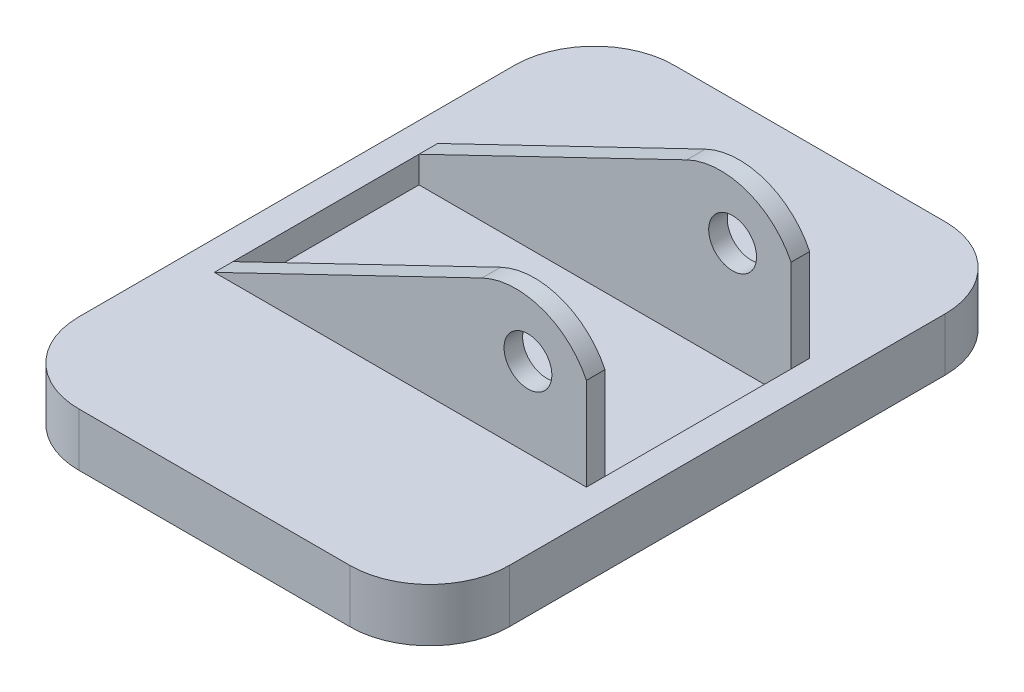
ISO-10303-21;
HEADER;
FILE_DESCRIPTION(('STEP AP214'),'2;1');
FILE_NAME('part.step','',(''),(''),'','','');
FILE_SCHEMA(('AUTOMOTIVE_DESIGN { 1 0 10303 214 1 1 1 1 }'));
ENDSEC;
DATA;
#1=APPLICATION_CONTEXT('core data for automotive mechanical design processes');
#2=APPLICATION_PROTOCOL_DEFINITION('international standard','automotive_design',2000,#1);
#3=PRODUCT_CONTEXT('',#1,'mechanical');
#4=PRODUCT('Part','Part','',(#3));
#5=PRODUCT_RELATED_PRODUCT_CATEGORY('part','',(#4));
#6=PRODUCT_DEFINITION_FORMATION('','',#4);
#7=PRODUCT_DEFINITION_CONTEXT('part definition',#1,'design');
#8=PRODUCT_DEFINITION('design','',#6,#7);
#9=PRODUCT_DEFINITION_SHAPE('','',#8);
#10=(LENGTH_UNIT() NAMED_UNIT(*) SI_UNIT(.MILLI.,.METRE.));
#11=(NAMED_UNIT(*) PLANE_ANGLE_UNIT() SI_UNIT($,.RADIAN.));
#12=(NAMED_UNIT(*) SI_UNIT($,.STERADIAN.) SOLID_ANGLE_UNIT());
#13=UNCERTAINTY_MEASURE_WITH_UNIT(LENGTH_MEASURE(1.E-05),#10,'distance_accuracy_value','');
#14=(GEOMETRIC_REPRESENTATION_CONTEXT(3) GLOBAL_UNCERTAINTY_ASSIGNED_CONTEXT((#13)) GLOBAL_UNIT_ASSIGNED_CONTEXT((#10,
#11,#12)) REPRESENTATION_CONTEXT('',''));
#15=CARTESIAN_POINT('',(0.,0.,0.));
#16=DIRECTION('',(0.,0.,1.));
#17=DIRECTION('',(1.,0.,0.));
#18=AXIS2_PLACEMENT_3D('',#15,#16,#17);
#19=CARTESIAN_POINT('',(75.5,37.,-35.));
#20=DIRECTION('',(-1.,0.,0.));
#21=DIRECTION('',(0.,0.,1.));
#22=AXIS2_PLACEMENT_3D('',#19,#20,#21);
#23=PLANE('',#22);
#24=DIRECTION('',(0.,1.,0.));
#25=VECTOR('',#24,1.);
#26=CARTESIAN_POINT('',(75.5,5.,-38.5));
#27=LINE('',#26,#25);
#28=CARTESIAN_POINT('',(75.5,10.,-38.5));
#29=VERTEX_POINT('',#28);
#30=CARTESIAN_POINT('',(75.5,27.396377444738,-38.5));
#31=VERTEX_POINT('',#30);
#32=EDGE_CURVE('E240',#29,#31,#27,.T.);
#33=ORIENTED_EDGE('',*,*,#32,.T.);
#34=DIRECTION('',(0.,0.,1.));
#35=VECTOR('',#34,1.);
#36=CARTESIAN_POINT('',(75.5,27.396377444738,-112.));
#37=LINE('',#36,#35);
#38=CARTESIAN_POINT('',(75.5,27.396377444738,-35.));
#39=VERTEX_POINT('',#38);
#40=EDGE_CURVE('E55',#31,#39,#37,.T.);
#41=ORIENTED_EDGE('',*,*,#40,.T.);
#42=DIRECTION('',(0.,-1.,0.));
#43=VECTOR('',#42,1.);
#44=CARTESIAN_POINT('',(75.5,37.,-35.));
#45=LINE('',#44,#43);
#46=CARTESIAN_POINT('',(75.5,10.,-35.));
#47=VERTEX_POINT('',#46);
#48=EDGE_CURVE('E185',#39,#47,#45,.T.);
#49=ORIENTED_EDGE('',*,*,#48,.T.);
#50=DIRECTION('',(0.,0.,-1.));
#51=VECTOR('',#50,1.);
#52=CARTESIAN_POINT('',(75.5,10.,-35.));
#53=LINE('',#52,#51);
#54=EDGE_CURVE('E260',#47,#29,#53,.T.);
#55=ORIENTED_EDGE('',*,*,#54,.T.);
#56=EDGE_LOOP('',(#33,#41,#49,#55));
#57=FACE_BOUND('',#56,.T.);
#58=ADVANCED_FACE('F39',(#57),#23,.F.);
#59=CARTESIAN_POINT('',(66.,10.,-15.));
#60=DIRECTION('',(0.,1.,0.));
#61=DIRECTION('',(0.,0.,1.));
#62=AXIS2_PLACEMENT_3D('',#59,#60,#61);
#63=PLANE('',#62);
#64=CARTESIAN_POINT('',(15.,10.,-97.));
#65=DIRECTION('',(0.,1.,0.));
#66=DIRECTION('',(0.,0.,-1.));
#67=AXIS2_PLACEMENT_3D('',#64,#65,#66);
#68=CIRCLE('',#67,15.);
#69=CARTESIAN_POINT('',(15.,10.,-112.));
#70=VERTEX_POINT('',#69);
#71=CARTESIAN_POINT('',(0.,10.,-96.9999999999999));
#72=VERTEX_POINT('',#71);
#73=EDGE_CURVE('E294',#70,#72,#68,.T.);
#74=ORIENTED_EDGE('',*,*,#73,.T.);
#75=DIRECTION('',(0.,0.,1.));
#76=VECTOR('',#75,1.);
#77=CARTESIAN_POINT('',(0.,10.,-15.0000000000001));
#78=LINE('',#77,#76);
#79=CARTESIAN_POINT('',(0.,10.,-15.0000000000001));
#80=VERTEX_POINT('',#79);
#81=EDGE_CURVE('E297',#72,#80,#78,.T.);
#82=ORIENTED_EDGE('',*,*,#81,.T.);
#83=CARTESIAN_POINT('',(15.,10.,-15.));
#84=DIRECTION('',(0.,1.,0.));
#85=DIRECTION('',(0.,0.,-1.));
#86=AXIS2_PLACEMENT_3D('',#83,#84,#85);
#87=CIRCLE('',#86,15.);
#88=CARTESIAN_POINT('',(15.0000000000001,10.,0.));
#89=VERTEX_POINT('',#88);
#90=EDGE_CURVE('E300',#80,#89,#87,.T.);
#91=ORIENTED_EDGE('',*,*,#90,.T.);
#92=DIRECTION('',(1.,0.,0.));
#93=VECTOR('',#92,1.);
#94=CARTESIAN_POINT('',(15.0000000000001,10.,0.));
#95=LINE('',#94,#93);
#96=CARTESIAN_POINT('',(65.9999999999999,10.,0.));
#97=VERTEX_POINT('',#96);
#98=EDGE_CURVE('E303',#89,#97,#95,.T.);
#99=ORIENTED_EDGE('',*,*,#98,.T.);
#100=CARTESIAN_POINT('',(66.,10.,-15.));
#101=DIRECTION('',(0.,1.,0.));
#102=DIRECTION('',(0.,0.,1.));
#103=AXIS2_PLACEMENT_3D('',#100,#101,#102);
#104=CIRCLE('',#103,15.);
#105=CARTESIAN_POINT('',(81.,10.,-15.0000000000001));
#106=VERTEX_POINT('',#105);
#107=EDGE_CURVE('E280',#97,#106,#104,.T.);
#108=ORIENTED_EDGE('',*,*,#107,.T.);
#109=DIRECTION('',(0.,0.,-1.));
#110=VECTOR('',#109,1.);
#111=CARTESIAN_POINT('',(81.,10.,-15.0000000000001));
#112=LINE('',#111,#110);
#113=CARTESIAN_POINT('',(81.,10.,-96.9999999999999));
#114=VERTEX_POINT('',#113);
#115=EDGE_CURVE('E284',#106,#114,#112,.T.);
#116=ORIENTED_EDGE('',*,*,#115,.T.);
#117=CARTESIAN_POINT('',(66.,10.,-97.));
#118=DIRECTION('',(0.,1.,0.));
#119=DIRECTION('',(0.,0.,1.));
#120=AXIS2_PLACEMENT_3D('',#117,#118,#119);
#121=CIRCLE('',#120,15.);
#122=CARTESIAN_POINT('',(65.9999999999999,10.,-112.));
#123=VERTEX_POINT('',#122);
#124=EDGE_CURVE('E288',#114,#123,#121,.T.);
#125=ORIENTED_EDGE('',*,*,#124,.T.);
#126=DIRECTION('',(-1.,0.,0.));
#127=VECTOR('',#126,1.);
#128=CARTESIAN_POINT('',(15.0000000000001,10.,-112.));
#129=LINE('',#128,#127);
#130=EDGE_CURVE('E291',#123,#70,#129,.T.);
#131=ORIENTED_EDGE('',*,*,#130,.T.);
#132=EDGE_LOOP('',(#74,#82,#91,#99,#108,#116,#125,#131));
#133=FACE_BOUND('',#132,.T.);
#134=DIRECTION('',(0.,0.,1.));
#135=VECTOR('',#134,1.);
#136=CARTESIAN_POINT('',(5.50000000000001,10.,-35.));
#137=LINE('',#136,#135);
#138=CARTESIAN_POINT('',(5.50000000000001,10.,-77.));
#139=VERTEX_POINT('',#138);
#140=CARTESIAN_POINT('',(5.50000000000001,10.,-73.5));
#141=VERTEX_POINT('',#140);
#142=EDGE_CURVE('E268',#139,#141,#137,.T.);
#143=ORIENTED_EDGE('',*,*,#142,.F.);
#144=DIRECTION('',(-1.,0.,0.));
#145=VECTOR('',#144,1.);
#146=CARTESIAN_POINT('',(5.50000000000001,10.,-77.));
#147=LINE('',#146,#145);
#148=CARTESIAN_POINT('',(75.5,10.,-77.));
#149=VERTEX_POINT('',#148);
#150=EDGE_CURVE('E264',#149,#139,#147,.T.);
#151=ORIENTED_EDGE('',*,*,#150,.F.);
#152=CARTESIAN_POINT('',(75.5,10.,-73.5));
#153=VERTEX_POINT('',#152);
#154=EDGE_CURVE('E259',#153,#149,#53,.T.);
#155=ORIENTED_EDGE('',*,*,#154,.F.);
#156=DIRECTION('',(0.,0.,-1.));
#157=VECTOR('',#156,1.);
#158=CARTESIAN_POINT('',(75.5,10.,-15.));
#159=LINE('',#158,#157);
#160=EDGE_CURVE('E256',#29,#153,#159,.T.);
#161=ORIENTED_EDGE('',*,*,#160,.F.);
#162=ORIENTED_EDGE('',*,*,#54,.F.);
#163=DIRECTION('',(1.,0.,0.));
#164=VECTOR('',#163,1.);
#165=CARTESIAN_POINT('',(5.50000000000001,10.,-35.));
#166=LINE('',#165,#164);
#167=CARTESIAN_POINT('',(5.50000000000001,10.,-35.));
#168=VERTEX_POINT('',#167);
#169=EDGE_CURVE('E271',#168,#47,#166,.T.);
#170=ORIENTED_EDGE('',*,*,#169,.F.);
#171=CARTESIAN_POINT('',(5.50000000000001,10.,-38.5));
#172=VERTEX_POINT('',#171);
#173=EDGE_CURVE('E177',#172,#168,#137,.T.);
#174=ORIENTED_EDGE('',*,*,#173,.F.);
#175=DIRECTION('',(0.,0.,1.));
#176=VECTOR('',#175,1.);
#177=CARTESIAN_POINT('',(5.50000000000001,10.,-15.));
#178=LINE('',#177,#176);
#179=EDGE_CURVE('E239',#141,#172,#178,.T.);
#180=ORIENTED_EDGE('',*,*,#179,.F.);
#181=EDGE_LOOP('',(#143,#151,#155,#161,#162,#170,#174,#180));
#182=FACE_BOUND('',#181,.T.);
#183=ADVANCED_FACE('F387',(#133,#182),#63,.T.);
#184=CARTESIAN_POINT('',(66.,10.,-15.));
#185=DIRECTION('',(0.,-1.,0.));
#186=DIRECTION('',(0.,0.,-1.));
#187=AXIS2_PLACEMENT_3D('',#184,#185,#186);
#188=CYLINDRICAL_SURFACE('',#187,15.);
#189=CARTESIAN_POINT('',(66.,0.,-15.));
#190=DIRECTION('',(0.,1.,0.));
#191=DIRECTION('',(0.,0.,1.));
#192=AXIS2_PLACEMENT_3D('',#189,#190,#191);
#193=CIRCLE('',#192,15.);
#194=CARTESIAN_POINT('',(65.9999999999999,0.,0.));
#195=VERTEX_POINT('',#194);
#196=CARTESIAN_POINT('',(81.,0.,-15.0000000000001));
#197=VERTEX_POINT('',#196);
#198=EDGE_CURVE('E279',#195,#197,#193,.T.);
#199=ORIENTED_EDGE('',*,*,#198,.T.);
#200=DIRECTION('',(0.,-1.,0.));
#201=VECTOR('',#200,1.);
#202=CARTESIAN_POINT('',(81.,10.,-15.0000000000001));
#203=LINE('',#202,#201);
#204=EDGE_CURVE('E357',#106,#197,#203,.T.);
#205=ORIENTED_EDGE('',*,*,#204,.F.);
#206=ORIENTED_EDGE('',*,*,#107,.F.);
#207=DIRECTION('',(0.,-1.,0.));
#208=VECTOR('',#207,1.);
#209=CARTESIAN_POINT('',(65.9999999999999,10.,0.));
#210=LINE('',#209,#208);
#211=EDGE_CURVE('E306',#97,#195,#210,.T.);
#212=ORIENTED_EDGE('',*,*,#211,.T.);
#213=EDGE_LOOP('',(#199,#205,#206,#212));
#214=FACE_BOUND('',#213,.T.);
#215=ADVANCED_FACE('F41',(#214),#188,.T.);
#216=CARTESIAN_POINT('',(81.,10.,-15.0000000000001));
#217=DIRECTION('',(-1.,0.,0.));
#218=DIRECTION('',(0.,0.,1.));
#219=AXIS2_PLACEMENT_3D('',#216,#217,#218);
#220=PLANE('',#219);
#221=DIRECTION('',(0.,0.,-1.));
#222=VECTOR('',#221,1.);
#223=CARTESIAN_POINT('',(81.,0.,-15.0000000000001));
#224=LINE('',#223,#222);
#225=CARTESIAN_POINT('',(81.,0.,-96.9999999999999));
#226=VERTEX_POINT('',#225);
#227=EDGE_CURVE('E310',#197,#226,#224,.T.);
#228=ORIENTED_EDGE('',*,*,#227,.T.);
#229=DIRECTION('',(0.,-1.,0.));
#230=VECTOR('',#229,1.);
#231=CARTESIAN_POINT('',(81.,10.,-96.9999999999999));
#232=LINE('',#231,#230);
#233=EDGE_CURVE('E353',#114,#226,#232,.T.);
#234=ORIENTED_EDGE('',*,*,#233,.F.);
#235=ORIENTED_EDGE('',*,*,#115,.F.);
#236=ORIENTED_EDGE('',*,*,#204,.T.);
#237=EDGE_LOOP('',(#228,#234,#235,#236));
#238=FACE_BOUND('',#237,.T.);
#239=ADVANCED_FACE('F449',(#238),#220,.F.);
#240=CARTESIAN_POINT('',(66.,10.,-97.));
#241=DIRECTION('',(0.,-1.,0.));
#242=DIRECTION('',(0.,0.,-1.));
#243=AXIS2_PLACEMENT_3D('',#240,#241,#242);
#244=CYLINDRICAL_SURFACE('',#243,15.);
#245=CARTESIAN_POINT('',(66.,0.,-97.));
#246=DIRECTION('',(0.,1.,0.));
#247=DIRECTION('',(0.,0.,1.));
#248=AXIS2_PLACEMENT_3D('',#245,#246,#247);
#249=CIRCLE('',#248,15.);
#250=CARTESIAN_POINT('',(65.9999999999999,0.,-112.));
#251=VERTEX_POINT('',#250);
#252=EDGE_CURVE('E313',#226,#251,#249,.T.);
#253=ORIENTED_EDGE('',*,*,#252,.T.);
#254=DIRECTION('',(0.,-1.,0.));
#255=VECTOR('',#254,1.);
#256=CARTESIAN_POINT('',(65.9999999999999,10.,-112.));
#257=LINE('',#256,#255);
#258=EDGE_CURVE('E349',#123,#251,#257,.T.);
#259=ORIENTED_EDGE('',*,*,#258,.F.);
#260=ORIENTED_EDGE('',*,*,#124,.F.);
#261=ORIENTED_EDGE('',*,*,#233,.T.);
#262=EDGE_LOOP('',(#253,#259,#260,#261));
#263=FACE_BOUND('',#262,.T.);
#264=ADVANCED_FACE('F446',(#263),#244,.T.);
#265=CARTESIAN_POINT('',(15.0000000000001,10.,-112.));
#266=DIRECTION('',(0.,0.,1.));
#267=DIRECTION('',(1.,0.,0.));
#268=AXIS2_PLACEMENT_3D('',#265,#266,#267);
#269=PLANE('',#268);
#270=DIRECTION('',(-1.,0.,0.));
#271=VECTOR('',#270,1.);
#272=CARTESIAN_POINT('',(15.0000000000001,0.,-112.));
#273=LINE('',#272,#271);
#274=CARTESIAN_POINT('',(15.,0.,-112.));
#275=VERTEX_POINT('',#274);
#276=EDGE_CURVE('E316',#251,#275,#273,.T.);
#277=ORIENTED_EDGE('',*,*,#276,.T.);
#278=DIRECTION('',(0.,-1.,0.));
#279=VECTOR('',#278,1.);
#280=CARTESIAN_POINT('',(15.,10.,-112.));
#281=LINE('',#280,#279);
#282=EDGE_CURVE('E345',#70,#275,#281,.T.);
#283=ORIENTED_EDGE('',*,*,#282,.F.);
#284=ORIENTED_EDGE('',*,*,#130,.F.);
#285=ORIENTED_EDGE('',*,*,#258,.T.);
#286=EDGE_LOOP('',(#277,#283,#284,#285));
#287=FACE_BOUND('',#286,.T.);
#288=ADVANCED_FACE('F442',(#287),#269,.F.);
#289=CARTESIAN_POINT('',(15.,10.,-97.));
#290=DIRECTION('',(0.,-1.,0.));
#291=DIRECTION('',(0.,0.,-1.));
#292=AXIS2_PLACEMENT_3D('',#289,#290,#291);
#293=CYLINDRICAL_SURFACE('',#292,15.);
#294=CARTESIAN_POINT('',(15.,0.,-97.));
#295=DIRECTION('',(0.,1.,0.));
#296=DIRECTION('',(0.,0.,-1.));
#297=AXIS2_PLACEMENT_3D('',#294,#295,#296);
#298=CIRCLE('',#297,15.);
#299=CARTESIAN_POINT('',(0.,0.,-96.9999999999999));
#300=VERTEX_POINT('',#299);
#301=EDGE_CURVE('E319',#275,#300,#298,.T.);
#302=ORIENTED_EDGE('',*,*,#301,.T.);
#303=DIRECTION('',(0.,-1.,0.));
#304=VECTOR('',#303,1.);
#305=CARTESIAN_POINT('',(0.,10.,-96.9999999999999));
#306=LINE('',#305,#304);
#307=EDGE_CURVE('E341',#72,#300,#306,.T.);
#308=ORIENTED_EDGE('',*,*,#307,.F.);
#309=ORIENTED_EDGE('',*,*,#73,.F.);
#310=ORIENTED_EDGE('',*,*,#282,.T.);
#311=EDGE_LOOP('',(#302,#308,#309,#310));
#312=FACE_BOUND('',#311,.T.);
#313=ADVANCED_FACE('F438',(#312),#293,.T.);
#314=CARTESIAN_POINT('',(0.,10.,-15.0000000000001));
#315=DIRECTION('',(1.,0.,0.));
#316=DIRECTION('',(0.,0.,-1.));
#317=AXIS2_PLACEMENT_3D('',#314,#315,#316);
#318=PLANE('',#317);
#319=DIRECTION('',(0.,0.,1.));
#320=VECTOR('',#319,1.);
#321=CARTESIAN_POINT('',(0.,0.,-15.0000000000001));
#322=LINE('',#321,#320);
#323=CARTESIAN_POINT('',(0.,0.,-15.0000000000001));
#324=VERTEX_POINT('',#323);
#325=EDGE_CURVE('E322',#300,#324,#322,.T.);
#326=ORIENTED_EDGE('',*,*,#325,.T.);
#327=DIRECTION('',(0.,-1.,0.));
#328=VECTOR('',#327,1.);
#329=CARTESIAN_POINT('',(0.,10.,-15.0000000000001));
#330=LINE('',#329,#328);
#331=EDGE_CURVE('E337',#80,#324,#330,.T.);
#332=ORIENTED_EDGE('',*,*,#331,.F.);
#333=ORIENTED_EDGE('',*,*,#81,.F.);
#334=ORIENTED_EDGE('',*,*,#307,.T.);
#335=EDGE_LOOP('',(#326,#332,#333,#334));
#336=FACE_BOUND('',#335,.T.);
#337=ADVANCED_FACE('F434',(#336),#318,.F.);
#338=CARTESIAN_POINT('',(15.,10.,-15.));
#339=DIRECTION('',(0.,-1.,0.));
#340=DIRECTION('',(0.,0.,-1.));
#341=AXIS2_PLACEMENT_3D('',#338,#339,#340);
#342=CYLINDRICAL_SURFACE('',#341,15.);
#343=CARTESIAN_POINT('',(15.,0.,-15.));
#344=DIRECTION('',(0.,1.,0.));
#345=DIRECTION('',(0.,0.,-1.));
#346=AXIS2_PLACEMENT_3D('',#343,#344,#345);
#347=CIRCLE('',#346,15.);
#348=CARTESIAN_POINT('',(15.0000000000001,0.,0.));
#349=VERTEX_POINT('',#348);
#350=EDGE_CURVE('E325',#324,#349,#347,.T.);
#351=ORIENTED_EDGE('',*,*,#350,.T.);
#352=DIRECTION('',(0.,-1.,0.));
#353=VECTOR('',#352,1.);
#354=CARTESIAN_POINT('',(15.0000000000001,10.,0.));
#355=LINE('',#354,#353);
#356=EDGE_CURVE('E333',#89,#349,#355,.T.);
#357=ORIENTED_EDGE('',*,*,#356,.F.);
#358=ORIENTED_EDGE('',*,*,#90,.F.);
#359=ORIENTED_EDGE('',*,*,#331,.T.);
#360=EDGE_LOOP('',(#351,#357,#358,#359));
#361=FACE_BOUND('',#360,.T.);
#362=ADVANCED_FACE('F427',(#361),#342,.T.);
#363=CARTESIAN_POINT('',(15.0000000000001,10.,0.));
#364=DIRECTION('',(0.,0.,-1.));
#365=DIRECTION('',(-1.,0.,0.));
#366=AXIS2_PLACEMENT_3D('',#363,#364,#365);
#367=PLANE('',#366);
#368=DIRECTION('',(1.,0.,0.));
#369=VECTOR('',#368,1.);
#370=CARTESIAN_POINT('',(15.0000000000001,0.,0.));
#371=LINE('',#370,#369);
#372=EDGE_CURVE('E285',#349,#195,#371,.T.);
#373=ORIENTED_EDGE('',*,*,#372,.T.);
#374=ORIENTED_EDGE('',*,*,#211,.F.);
#375=ORIENTED_EDGE('',*,*,#98,.F.);
#376=ORIENTED_EDGE('',*,*,#356,.T.);
#377=EDGE_LOOP('',(#373,#374,#375,#376));
#378=FACE_BOUND('',#377,.T.);
#379=ADVANCED_FACE('F421',(#378),#367,.F.);
#380=CARTESIAN_POINT('',(66.,0.,-15.));
#381=DIRECTION('',(0.,1.,0.));
#382=DIRECTION('',(0.,0.,1.));
#383=AXIS2_PLACEMENT_3D('',#380,#381,#382);
#384=PLANE('',#383);
#385=ORIENTED_EDGE('',*,*,#198,.F.);
#386=ORIENTED_EDGE('',*,*,#372,.F.);
#387=ORIENTED_EDGE('',*,*,#350,.F.);
#388=ORIENTED_EDGE('',*,*,#325,.F.);
#389=ORIENTED_EDGE('',*,*,#301,.F.);
#390=ORIENTED_EDGE('',*,*,#276,.F.);
#391=ORIENTED_EDGE('',*,*,#252,.F.);
#392=ORIENTED_EDGE('',*,*,#227,.F.);
#393=EDGE_LOOP('',(#385,#386,#387,#388,#389,#390,#391,#392));
#394=FACE_BOUND('',#393,.T.);
#395=ADVANCED_FACE('F415',(#394),#384,.F.);
#396=DIRECTION('',(0.,-1.,0.));
#397=VECTOR('',#396,1.);
#398=CARTESIAN_POINT('',(75.5,37.,-77.));
#399=LINE('',#398,#397);
#400=CARTESIAN_POINT('',(75.5,27.396377444738,-77.));
#401=VERTEX_POINT('',#400);
#402=EDGE_CURVE('E276',#401,#149,#399,.T.);
#403=ORIENTED_EDGE('',*,*,#402,.F.);
#404=CARTESIAN_POINT('',(75.5,27.396377444738,-73.5));
#405=VERTEX_POINT('',#404);
#406=EDGE_CURVE('E190',#401,#405,#37,.T.);
#407=ORIENTED_EDGE('',*,*,#406,.T.);
#408=DIRECTION('',(0.,1.,0.));
#409=VECTOR('',#408,1.);
#410=CARTESIAN_POINT('',(75.5,5.,-73.5));
#411=LINE('',#410,#409);
#412=EDGE_CURVE('E234',#153,#405,#411,.T.);
#413=ORIENTED_EDGE('',*,*,#412,.F.);
#414=ORIENTED_EDGE('',*,*,#154,.T.);
#415=EDGE_LOOP('',(#403,#407,#413,#414));
#416=FACE_BOUND('',#415,.T.);
#417=ADVANCED_FACE('F373',(#416),#23,.F.);
#418=CARTESIAN_POINT('',(5.50000000000001,37.,-77.));
#419=DIRECTION('',(0.,0.,1.));
#420=DIRECTION('',(1.,0.,0.));
#421=AXIS2_PLACEMENT_3D('',#418,#419,#420);
#422=PLANE('',#421);
#423=CARTESIAN_POINT('',(64.5,25.,-77.));
#424=DIRECTION('',(0.,0.,1.));
#425=DIRECTION('',(1.,0.,0.));
#426=AXIS2_PLACEMENT_3D('',#423,#424,#425);
#427=CIRCLE('',#426,4.5);
#428=CARTESIAN_POINT('',(69.,25.,-77.));
#429=VERTEX_POINT('',#428);
#430=EDGE_CURVE('E201',#429,#429,#427,.T.);
#431=ORIENTED_EDGE('',*,*,#430,.T.);
#432=EDGE_LOOP('',(#431));
#433=FACE_BOUND('',#432,.T.);
#434=ORIENTED_EDGE('',*,*,#150,.T.);
#435=DIRECTION('',(0.900911766554061,0.434002291335473,0.));
#436=VECTOR('',#435,1.);
#437=CARTESIAN_POINT('',(16.0569398163399,15.0856656998799,-77.));
#438=LINE('',#437,#436);
#439=CARTESIAN_POINT('',(55.866672389115,34.2634762196852,-77.));
#440=VERTEX_POINT('',#439);
#441=EDGE_CURVE('E214',#139,#440,#438,.T.);
#442=ORIENTED_EDGE('',*,*,#441,.T.);
#443=CARTESIAN_POINT('',(62.249786807084,21.0132630267691,-77.));
#444=DIRECTION('',(0.,0.,1.));
#445=DIRECTION('',(1.,0.,0.));
#446=AXIS2_PLACEMENT_3D('',#443,#444,#445);
#447=CIRCLE('',#446,14.7075592581029);
#448=EDGE_CURVE('E207',#440,#401,#447,.F.);
#449=ORIENTED_EDGE('',*,*,#448,.T.);
#450=ORIENTED_EDGE('',*,*,#402,.T.);
#451=EDGE_LOOP('',(#434,#442,#449,#450));
#452=FACE_BOUND('',#451,.T.);
#453=ADVANCED_FACE('F390',(#433,#452),#422,.F.);
#454=CARTESIAN_POINT('',(5.50000000000001,37.,-35.));
#455=DIRECTION('',(0.,0.,-1.));
#456=DIRECTION('',(-1.,0.,0.));
#457=AXIS2_PLACEMENT_3D('',#454,#455,#456);
#458=PLANE('',#457);
#459=CARTESIAN_POINT('',(64.5,25.,-35.));
#460=DIRECTION('',(0.,0.,1.));
#461=DIRECTION('',(1.,0.,0.));
#462=AXIS2_PLACEMENT_3D('',#459,#460,#461);
#463=CIRCLE('',#462,4.5);
#464=CARTESIAN_POINT('',(69.,25.,-35.));
#465=VERTEX_POINT('',#464);
#466=EDGE_CURVE('E192',#465,#465,#463,.T.);
#467=ORIENTED_EDGE('',*,*,#466,.F.);
#468=EDGE_LOOP('',(#467));
#469=FACE_BOUND('',#468,.T.);
#470=CARTESIAN_POINT('',(62.249786807084,21.0132630267691,-35.));
#471=DIRECTION('',(0.,0.,-1.));
#472=DIRECTION('',(-1.,0.,0.));
#473=AXIS2_PLACEMENT_3D('',#470,#471,#472);
#474=CIRCLE('',#473,14.7075592581029);
#475=CARTESIAN_POINT('',(55.866672389115,34.2634762196852,-35.));
#476=VERTEX_POINT('',#475);
#477=EDGE_CURVE('E167',#476,#39,#474,.T.);
#478=ORIENTED_EDGE('',*,*,#477,.F.);
#479=DIRECTION('',(0.900911766554061,0.434002291335473,0.));
#480=VECTOR('',#479,1.);
#481=CARTESIAN_POINT('',(5.50000000000001,10.,-35.));
#482=LINE('',#481,#480);
#483=EDGE_CURVE('E174',#168,#476,#482,.T.);
#484=ORIENTED_EDGE('',*,*,#483,.F.);
#485=ORIENTED_EDGE('',*,*,#169,.T.);
#486=ORIENTED_EDGE('',*,*,#48,.F.);
#487=EDGE_LOOP('',(#478,#484,#485,#486));
#488=FACE_BOUND('',#487,.T.);
#489=ADVANCED_FACE('F184',(#469,#488),#458,.F.);
#490=CARTESIAN_POINT('',(75.5,5.,-38.5));
#491=DIRECTION('',(1.,0.,0.));
#492=DIRECTION('',(0.,0.,-1.));
#493=AXIS2_PLACEMENT_3D('',#490,#491,#492);
#494=PLANE('',#493);
#495=ORIENTED_EDGE('',*,*,#160,.T.);
#496=CARTESIAN_POINT('',(75.5,5.,-73.5));
#497=VERTEX_POINT('',#496);
#498=EDGE_CURVE('E249',#497,#153,#411,.T.);
#499=ORIENTED_EDGE('',*,*,#498,.F.);
#500=DIRECTION('',(0.,0.,-1.));
#501=VECTOR('',#500,1.);
#502=CARTESIAN_POINT('',(75.5,5.,-38.5));
#503=LINE('',#502,#501);
#504=CARTESIAN_POINT('',(75.5,5.,-38.5));
#505=VERTEX_POINT('',#504);
#506=EDGE_CURVE('E218',#505,#497,#503,.T.);
#507=ORIENTED_EDGE('',*,*,#506,.F.);
#508=EDGE_CURVE('E235',#505,#29,#27,.T.);
#509=ORIENTED_EDGE('',*,*,#508,.T.);
#510=EDGE_LOOP('',(#495,#499,#507,#509));
#511=FACE_BOUND('',#510,.T.);
#512=ADVANCED_FACE('F515',(#511),#494,.F.);
#513=CARTESIAN_POINT('',(5.5,5.,-38.5));
#514=DIRECTION('',(0.,0.,1.));
#515=DIRECTION('',(1.,0.,0.));
#516=AXIS2_PLACEMENT_3D('',#513,#514,#515);
#517=PLANE('',#516);
#518=CARTESIAN_POINT('',(64.5,25.,-38.5));
#519=DIRECTION('',(0.,0.,1.));
#520=DIRECTION('',(1.,0.,0.));
#521=AXIS2_PLACEMENT_3D('',#518,#519,#520);
#522=CIRCLE('',#521,4.5);
#523=CARTESIAN_POINT('',(69.,25.,-38.5));
#524=VERTEX_POINT('',#523);
#525=EDGE_CURVE('E197',#524,#524,#522,.T.);
#526=ORIENTED_EDGE('',*,*,#525,.T.);
#527=EDGE_LOOP('',(#526));
#528=FACE_BOUND('',#527,.T.);
#529=DIRECTION('',(0.,1.,0.));
#530=VECTOR('',#529,1.);
#531=CARTESIAN_POINT('',(5.5,5.,-38.5));
#532=LINE('',#531,#530);
#533=CARTESIAN_POINT('',(5.5,5.,-38.5));
#534=VERTEX_POINT('',#533);
#535=EDGE_CURVE('E241',#534,#172,#532,.T.);
#536=ORIENTED_EDGE('',*,*,#535,.T.);
#537=DIRECTION('',(0.900911766554061,0.434002291335473,0.));
#538=VECTOR('',#537,1.);
#539=CARTESIAN_POINT('',(3.54501114512225,9.0582100555778,-38.5));
#540=LINE('',#539,#538);
#541=CARTESIAN_POINT('',(55.866672389115,34.2634762196852,-38.5));
#542=VERTEX_POINT('',#541);
#543=EDGE_CURVE('E211',#172,#542,#540,.T.);
#544=ORIENTED_EDGE('',*,*,#543,.T.);
#545=CARTESIAN_POINT('',(62.249786807084,21.0132630267691,-38.5));
#546=DIRECTION('',(0.,0.,1.));
#547=DIRECTION('',(1.,0.,0.));
#548=AXIS2_PLACEMENT_3D('',#545,#546,#547);
#549=CIRCLE('',#548,14.7075592581029);
#550=EDGE_CURVE('E168',#542,#31,#549,.F.);
#551=ORIENTED_EDGE('',*,*,#550,.T.);
#552=ORIENTED_EDGE('',*,*,#32,.F.);
#553=ORIENTED_EDGE('',*,*,#508,.F.);
#554=DIRECTION('',(1.,0.,0.));
#555=VECTOR('',#554,1.);
#556=CARTESIAN_POINT('',(5.5,5.,-38.5));
#557=LINE('',#556,#555);
#558=EDGE_CURVE('E230',#534,#505,#557,.T.);
#559=ORIENTED_EDGE('',*,*,#558,.F.);
#560=EDGE_LOOP('',(#536,#544,#551,#552,#553,#559));
#561=FACE_BOUND('',#560,.T.);
#562=ADVANCED_FACE('F522',(#528,#561),#517,.F.);
#563=CARTESIAN_POINT('',(5.5,5.,-38.5));
#564=DIRECTION('',(-1.,0.,0.));
#565=DIRECTION('',(0.,0.,1.));
#566=AXIS2_PLACEMENT_3D('',#563,#564,#565);
#567=PLANE('',#566);
#568=ORIENTED_EDGE('',*,*,#179,.T.);
#569=ORIENTED_EDGE('',*,*,#535,.F.);
#570=DIRECTION('',(0.,0.,1.));
#571=VECTOR('',#570,1.);
#572=CARTESIAN_POINT('',(5.5,5.,-38.5));
#573=LINE('',#572,#571);
#574=CARTESIAN_POINT('',(5.5,5.,-73.5));
#575=VERTEX_POINT('',#574);
#576=EDGE_CURVE('E226',#575,#534,#573,.T.);
#577=ORIENTED_EDGE('',*,*,#576,.F.);
#578=DIRECTION('',(0.,1.,0.));
#579=VECTOR('',#578,1.);
#580=CARTESIAN_POINT('',(5.5,5.,-73.5));
#581=LINE('',#580,#579);
#582=EDGE_CURVE('E245',#575,#141,#581,.T.);
#583=ORIENTED_EDGE('',*,*,#582,.T.);
#584=EDGE_LOOP('',(#568,#569,#577,#583));
#585=FACE_BOUND('',#584,.T.);
#586=ADVANCED_FACE('F527',(#585),#567,.F.);
#587=CARTESIAN_POINT('',(5.5,5.,-73.5));
#588=DIRECTION('',(0.,0.,-1.));
#589=DIRECTION('',(-1.,0.,0.));
#590=AXIS2_PLACEMENT_3D('',#587,#588,#589);
#591=PLANE('',#590);
#592=CARTESIAN_POINT('',(64.5,25.,-73.5));
#593=DIRECTION('',(0.,0.,-1.));
#594=DIRECTION('',(-1.,0.,0.));
#595=AXIS2_PLACEMENT_3D('',#592,#593,#594);
#596=CIRCLE('',#595,4.5);
#597=CARTESIAN_POINT('',(60.,25.,-73.5));
#598=VERTEX_POINT('',#597);
#599=EDGE_CURVE('E196',#598,#598,#596,.T.);
#600=ORIENTED_EDGE('',*,*,#599,.T.);
#601=EDGE_LOOP('',(#600));
#602=FACE_BOUND('',#601,.T.);
#603=CARTESIAN_POINT('',(62.249786807084,21.0132630267691,-73.5));
#604=DIRECTION('',(0.,0.,-1.));
#605=DIRECTION('',(-1.,0.,0.));
#606=AXIS2_PLACEMENT_3D('',#603,#604,#605);
#607=CIRCLE('',#606,14.7075592581029);
#608=CARTESIAN_POINT('',(55.866672389115,34.2634762196852,-73.5));
#609=VERTEX_POINT('',#608);
#610=EDGE_CURVE('E48',#405,#609,#607,.F.);
#611=ORIENTED_EDGE('',*,*,#610,.T.);
#612=DIRECTION('',(-0.900911766554061,-0.434002291335473,0.));
#613=VECTOR('',#612,1.);
#614=CARTESIAN_POINT('',(3.54501114512225,9.0582100555778,-73.5));
#615=LINE('',#614,#613);
#616=EDGE_CURVE('E11',#609,#141,#615,.T.);
#617=ORIENTED_EDGE('',*,*,#616,.T.);
#618=ORIENTED_EDGE('',*,*,#582,.F.);
#619=DIRECTION('',(-1.,0.,0.));
#620=VECTOR('',#619,1.);
#621=CARTESIAN_POINT('',(5.5,5.,-73.5));
#622=LINE('',#621,#620);
#623=EDGE_CURVE('E222',#497,#575,#622,.T.);
#624=ORIENTED_EDGE('',*,*,#623,.F.);
#625=ORIENTED_EDGE('',*,*,#498,.T.);
#626=ORIENTED_EDGE('',*,*,#412,.T.);
#627=EDGE_LOOP('',(#611,#617,#618,#624,#625,#626));
#628=FACE_BOUND('',#627,.T.);
#629=ADVANCED_FACE('F367',(#602,#628),#591,.F.);
#630=CARTESIAN_POINT('',(0.,5.,0.));
#631=DIRECTION('',(0.,-1.,0.));
#632=DIRECTION('',(0.,0.,-1.));
#633=AXIS2_PLACEMENT_3D('',#630,#631,#632);
#634=PLANE('',#633);
#635=ORIENTED_EDGE('',*,*,#506,.T.);
#636=ORIENTED_EDGE('',*,*,#623,.T.);
#637=ORIENTED_EDGE('',*,*,#576,.T.);
#638=ORIENTED_EDGE('',*,*,#558,.T.);
#639=EDGE_LOOP('',(#635,#636,#637,#638));
#640=FACE_BOUND('',#639,.T.);
#641=ADVANCED_FACE('F547',(#640),#634,.F.);
#642=CARTESIAN_POINT('',(64.5,25.,-112.));
#643=DIRECTION('',(0.,0.,1.));
#644=DIRECTION('',(1.,0.,0.));
#645=AXIS2_PLACEMENT_3D('',#642,#643,#644);
#646=CYLINDRICAL_SURFACE('',#645,4.5);
#647=ORIENTED_EDGE('',*,*,#599,.F.);
#648=EDGE_LOOP('',(#647));
#649=FACE_BOUND('',#648,.T.);
#650=ORIENTED_EDGE('',*,*,#430,.F.);
#651=EDGE_LOOP('',(#650));
#652=FACE_BOUND('',#651,.T.);
#653=ADVANCED_FACE('F402',(#649,#652),#646,.F.);
#654=CARTESIAN_POINT('',(62.249786807084,21.0132630267691,-112.));
#655=DIRECTION('',(0.,0.,1.));
#656=DIRECTION('',(1.,0.,0.));
#657=AXIS2_PLACEMENT_3D('',#654,#655,#656);
#658=CYLINDRICAL_SURFACE('',#657,14.7075592581029);
#659=DIRECTION('',(0.,0.,1.));
#660=VECTOR('',#659,1.);
#661=CARTESIAN_POINT('',(55.866672389115,34.2634762196852,-112.));
#662=LINE('',#661,#660);
#663=EDGE_CURVE('E63',#440,#609,#662,.T.);
#664=ORIENTED_EDGE('',*,*,#663,.T.);
#665=ORIENTED_EDGE('',*,*,#610,.F.);
#666=ORIENTED_EDGE('',*,*,#406,.F.);
#667=ORIENTED_EDGE('',*,*,#448,.F.);
#668=EDGE_LOOP('',(#664,#665,#666,#667));
#669=FACE_BOUND('',#668,.T.);
#670=ADVANCED_FACE('F370',(#669),#658,.T.);
#671=CARTESIAN_POINT('',(5.50000000000001,10.,-112.));
#672=DIRECTION('',(0.434002291335473,-0.900911766554061,0.));
#673=DIRECTION('',(0.900911766554061,0.434002291335473,0.));
#674=AXIS2_PLACEMENT_3D('',#671,#672,#673);
#675=PLANE('',#674);
#676=ORIENTED_EDGE('',*,*,#142,.T.);
#677=ORIENTED_EDGE('',*,*,#616,.F.);
#678=ORIENTED_EDGE('',*,*,#663,.F.);
#679=ORIENTED_EDGE('',*,*,#441,.F.);
#680=EDGE_LOOP('',(#676,#677,#678,#679));
#681=FACE_BOUND('',#680,.T.);
#682=ADVANCED_FACE('F392',(#681),#675,.F.);
#683=ORIENTED_EDGE('',*,*,#466,.T.);
#684=EDGE_LOOP('',(#683));
#685=FACE_BOUND('',#684,.T.);
#686=ORIENTED_EDGE('',*,*,#525,.F.);
#687=EDGE_LOOP('',(#686));
#688=FACE_BOUND('',#687,.T.);
#689=ADVANCED_FACE('F394',(#685,#688),#646,.F.);
#690=ORIENTED_EDGE('',*,*,#173,.T.);
#691=ORIENTED_EDGE('',*,*,#483,.T.);
#692=EDGE_CURVE('E163',#542,#476,#662,.T.);
#693=ORIENTED_EDGE('',*,*,#692,.F.);
#694=ORIENTED_EDGE('',*,*,#543,.F.);
#695=EDGE_LOOP('',(#690,#691,#693,#694));
#696=FACE_BOUND('',#695,.T.);
#697=ADVANCED_FACE('F175',(#696),#675,.F.);
#698=ORIENTED_EDGE('',*,*,#692,.T.);
#699=ORIENTED_EDGE('',*,*,#477,.T.);
#700=ORIENTED_EDGE('',*,*,#40,.F.);
#701=ORIENTED_EDGE('',*,*,#550,.F.);
#702=EDGE_LOOP('',(#698,#699,#700,#701));
#703=FACE_BOUND('',#702,.T.);
#704=ADVANCED_FACE('F165',(#703),#658,.T.);
#705=CLOSED_SHELL('',(#58,#183,#215,#239,#264,#288,#313,#337,#362,#379,#395,#417,#453,#489,#512,
#562,#586,#629,#641,#653,#670,#682,#689,#697,#704));
#706=MANIFOLD_SOLID_BREP('B2',#705);
#707=ADVANCED_BREP_SHAPE_REPRESENTATION('',(#18,#706),#14);
#708=SHAPE_DEFINITION_REPRESENTATION(#9,#707);
ENDSEC;
END-ISO-10303-21;
